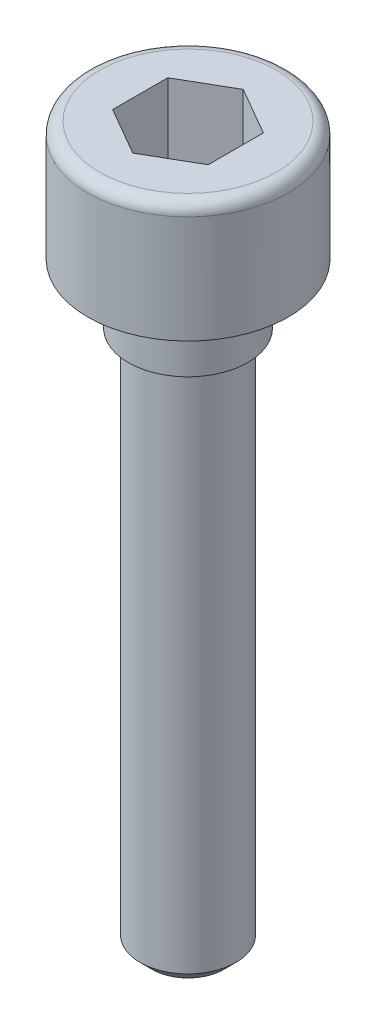
ISO-10303-21;
HEADER;
FILE_DESCRIPTION(('STEP AP214'),'2;1');
FILE_NAME('part.step','',(''),(''),'','','');
FILE_SCHEMA(('AUTOMOTIVE_DESIGN { 1 0 10303 214 1 1 1 1 }'));
ENDSEC;
DATA;
#1=APPLICATION_CONTEXT('core data for automotive mechanical design processes');
#2=APPLICATION_PROTOCOL_DEFINITION('international standard','automotive_design',2000,#1);
#3=PRODUCT_CONTEXT('',#1,'mechanical');
#4=PRODUCT('Part','Part','',(#3));
#5=PRODUCT_RELATED_PRODUCT_CATEGORY('part','',(#4));
#6=PRODUCT_DEFINITION_FORMATION('','',#4);
#7=PRODUCT_DEFINITION_CONTEXT('part definition',#1,'design');
#8=PRODUCT_DEFINITION('design','',#6,#7);
#9=PRODUCT_DEFINITION_SHAPE('','',#8);
#10=(LENGTH_UNIT() NAMED_UNIT(*) SI_UNIT(.MILLI.,.METRE.));
#11=(NAMED_UNIT(*) PLANE_ANGLE_UNIT() SI_UNIT($,.RADIAN.));
#12=(NAMED_UNIT(*) SI_UNIT($,.STERADIAN.) SOLID_ANGLE_UNIT());
#13=UNCERTAINTY_MEASURE_WITH_UNIT(LENGTH_MEASURE(1.E-05),#10,'distance_accuracy_value','');
#14=(GEOMETRIC_REPRESENTATION_CONTEXT(3) GLOBAL_UNCERTAINTY_ASSIGNED_CONTEXT((#13)) GLOBAL_UNIT_ASSIGNED_CONTEXT((#10,
#11,#12)) REPRESENTATION_CONTEXT('',''));
#15=CARTESIAN_POINT('',(0.,0.,0.));
#16=DIRECTION('',(0.,0.,1.));
#17=DIRECTION('',(1.,0.,0.));
#18=AXIS2_PLACEMENT_3D('',#15,#16,#17);
#19=CARTESIAN_POINT('',(0.,0.,0.));
#20=DIRECTION('',(0.,1.,0.));
#21=DIRECTION('',(0.,0.,1.));
#22=AXIS2_PLACEMENT_3D('',#19,#20,#21);
#23=CYLINDRICAL_SURFACE('',#22,2.5);
#24=CARTESIAN_POINT('',(0.,-5.,0.));
#25=DIRECTION('',(0.,1.,0.));
#26=DIRECTION('',(0.,0.,1.));
#27=AXIS2_PLACEMENT_3D('',#24,#25,#26);
#28=CIRCLE('',#27,2.5);
#29=CARTESIAN_POINT('',(0.,-5.,2.5));
#30=VERTEX_POINT('',#29);
#31=EDGE_CURVE('E151',#30,#30,#28,.T.);
#32=ORIENTED_EDGE('',*,*,#31,.F.);
#33=EDGE_LOOP('',(#32));
#34=FACE_BOUND('',#33,.T.);
#35=CARTESIAN_POINT('',(0.,-7.5,0.));
#36=DIRECTION('',(0.,1.,0.));
#37=DIRECTION('',(0.,0.,1.));
#38=AXIS2_PLACEMENT_3D('',#35,#36,#37);
#39=CIRCLE('',#38,2.5);
#40=CARTESIAN_POINT('',(0.,-7.5,2.5));
#41=VERTEX_POINT('',#40);
#42=EDGE_CURVE('E138',#41,#41,#39,.T.);
#43=ORIENTED_EDGE('',*,*,#42,.T.);
#44=EDGE_LOOP('',(#43));
#45=FACE_BOUND('',#44,.T.);
#46=ADVANCED_FACE('F48',(#34,#45),#23,.T.);
#47=CARTESIAN_POINT('',(0.,0.,0.));
#48=DIRECTION('',(0.,-1.,0.));
#49=DIRECTION('',(0.,0.,-1.));
#50=AXIS2_PLACEMENT_3D('',#47,#48,#49);
#51=PLANE('',#50);
#52=CARTESIAN_POINT('',(0.,0.,0.));
#53=DIRECTION('',(0.,-1.,0.));
#54=DIRECTION('',(0.,0.,-1.));
#55=AXIS2_PLACEMENT_3D('',#52,#53,#54);
#56=CIRCLE('',#55,3.7);
#57=CARTESIAN_POINT('',(0.,0.,-3.7));
#58=VERTEX_POINT('',#57);
#59=EDGE_CURVE('E162',#58,#58,#56,.F.);
#60=ORIENTED_EDGE('',*,*,#59,.T.);
#61=EDGE_LOOP('',(#60));
#62=FACE_BOUND('',#61,.T.);
#63=DIRECTION('',(-0.866025403784438,0.,-0.5));
#64=VECTOR('',#63,1.);
#65=CARTESIAN_POINT('',(2.,0.,-1.15470053837925));
#66=LINE('',#65,#64);
#67=CARTESIAN_POINT('',(2.,0.,-1.15470053837925));
#68=VERTEX_POINT('',#67);
#69=CARTESIAN_POINT('',(0.,0.,-2.3094010767585));
#70=VERTEX_POINT('',#69);
#71=EDGE_CURVE('E137',#68,#70,#66,.T.);
#72=ORIENTED_EDGE('',*,*,#71,.F.);
#73=DIRECTION('',(0.,0.,-1.));
#74=VECTOR('',#73,1.);
#75=CARTESIAN_POINT('',(2.,0.,1.15470053837925));
#76=LINE('',#75,#74);
#77=CARTESIAN_POINT('',(2.,0.,1.15470053837925));
#78=VERTEX_POINT('',#77);
#79=EDGE_CURVE('E63',#78,#68,#76,.T.);
#80=ORIENTED_EDGE('',*,*,#79,.F.);
#81=DIRECTION('',(0.866025403784438,0.,-0.5));
#82=VECTOR('',#81,1.);
#83=CARTESIAN_POINT('',(0.,0.,2.3094010767585));
#84=LINE('',#83,#82);
#85=CARTESIAN_POINT('',(0.,0.,2.3094010767585));
#86=VERTEX_POINT('',#85);
#87=EDGE_CURVE('E147',#86,#78,#84,.T.);
#88=ORIENTED_EDGE('',*,*,#87,.F.);
#89=DIRECTION('',(0.866025403784438,0.,0.5));
#90=VECTOR('',#89,1.);
#91=CARTESIAN_POINT('',(-2.,0.,1.15470053837925));
#92=LINE('',#91,#90);
#93=CARTESIAN_POINT('',(-2.,0.,1.15470053837925));
#94=VERTEX_POINT('',#93);
#95=EDGE_CURVE('E145',#94,#86,#92,.T.);
#96=ORIENTED_EDGE('',*,*,#95,.F.);
#97=DIRECTION('',(0.,0.,1.));
#98=VECTOR('',#97,1.);
#99=CARTESIAN_POINT('',(-2.,0.,-1.15470053837925));
#100=LINE('',#99,#98);
#101=CARTESIAN_POINT('',(-2.,0.,-1.15470053837925));
#102=VERTEX_POINT('',#101);
#103=EDGE_CURVE('E111',#102,#94,#100,.T.);
#104=ORIENTED_EDGE('',*,*,#103,.F.);
#105=DIRECTION('',(-0.866025403784439,0.,0.5));
#106=VECTOR('',#105,1.);
#107=CARTESIAN_POINT('',(0.,0.,-2.3094010767585));
#108=LINE('',#107,#106);
#109=EDGE_CURVE('E141',#70,#102,#108,.T.);
#110=ORIENTED_EDGE('',*,*,#109,.F.);
#111=EDGE_LOOP('',(#72,#80,#88,#96,#104,#110));
#112=FACE_BOUND('',#111,.T.);
#113=ADVANCED_FACE('F184',(#62,#112),#51,.F.);
#114=CARTESIAN_POINT('',(0.,0.,0.));
#115=DIRECTION('',(0.,1.,0.));
#116=DIRECTION('',(0.,0.,1.));
#117=AXIS2_PLACEMENT_3D('',#114,#115,#116);
#118=CYLINDRICAL_SURFACE('',#117,4.2);
#119=CARTESIAN_POINT('',(0.,-0.5,0.));
#120=DIRECTION('',(0.,-1.,0.));
#121=DIRECTION('',(0.,0.,-1.));
#122=AXIS2_PLACEMENT_3D('',#119,#120,#121);
#123=CIRCLE('',#122,4.2);
#124=CARTESIAN_POINT('',(0.,-0.5,-4.2));
#125=VERTEX_POINT('',#124);
#126=EDGE_CURVE('E165',#125,#125,#123,.T.);
#127=ORIENTED_EDGE('',*,*,#126,.T.);
#128=EDGE_LOOP('',(#127));
#129=FACE_BOUND('',#128,.T.);
#130=CARTESIAN_POINT('',(0.,-5.,0.));
#131=DIRECTION('',(0.,1.,0.));
#132=DIRECTION('',(0.,0.,1.));
#133=AXIS2_PLACEMENT_3D('',#130,#131,#132);
#134=CIRCLE('',#133,4.2);
#135=CARTESIAN_POINT('',(0.,-5.,4.2));
#136=VERTEX_POINT('',#135);
#137=EDGE_CURVE('E159',#136,#136,#134,.T.);
#138=ORIENTED_EDGE('',*,*,#137,.T.);
#139=EDGE_LOOP('',(#138));
#140=FACE_BOUND('',#139,.T.);
#141=ADVANCED_FACE('F190',(#129,#140),#118,.T.);
#142=CARTESIAN_POINT('',(4.2,-5.,0.));
#143=DIRECTION('',(0.,1.,0.));
#144=DIRECTION('',(0.,0.,1.));
#145=AXIS2_PLACEMENT_3D('',#142,#143,#144);
#146=PLANE('',#145);
#147=ORIENTED_EDGE('',*,*,#137,.F.);
#148=EDGE_LOOP('',(#147));
#149=FACE_BOUND('',#148,.T.);
#150=ORIENTED_EDGE('',*,*,#31,.T.);
#151=EDGE_LOOP('',(#150));
#152=FACE_BOUND('',#151,.T.);
#153=ADVANCED_FACE('F197',(#149,#152),#146,.F.);
#154=CARTESIAN_POINT('',(2.,-3.,1.15470053837925));
#155=DIRECTION('',(1.,0.,0.));
#156=DIRECTION('',(0.,0.,-1.));
#157=AXIS2_PLACEMENT_3D('',#154,#155,#156);
#158=PLANE('',#157);
#159=ORIENTED_EDGE('',*,*,#79,.T.);
#160=DIRECTION('',(0.,1.,0.));
#161=VECTOR('',#160,1.);
#162=CARTESIAN_POINT('',(2.,-3.,-1.15470053837925));
#163=LINE('',#162,#161);
#164=CARTESIAN_POINT('',(2.,-3.,-1.15470053837925));
#165=VERTEX_POINT('',#164);
#166=EDGE_CURVE('E93',#165,#68,#163,.T.);
#167=ORIENTED_EDGE('',*,*,#166,.F.);
#168=DIRECTION('',(0.,0.,-1.));
#169=VECTOR('',#168,1.);
#170=CARTESIAN_POINT('',(2.,-3.,1.15470053837925));
#171=LINE('',#170,#169);
#172=CARTESIAN_POINT('',(2.,-3.,1.15470053837925));
#173=VERTEX_POINT('',#172);
#174=EDGE_CURVE('E149',#173,#165,#171,.T.);
#175=ORIENTED_EDGE('',*,*,#174,.F.);
#176=DIRECTION('',(0.,1.,0.));
#177=VECTOR('',#176,1.);
#178=CARTESIAN_POINT('',(2.,-3.,1.15470053837925));
#179=LINE('',#178,#177);
#180=EDGE_CURVE('E71',#173,#78,#179,.T.);
#181=ORIENTED_EDGE('',*,*,#180,.T.);
#182=EDGE_LOOP('',(#159,#167,#175,#181));
#183=FACE_BOUND('',#182,.T.);
#184=ADVANCED_FACE('F200',(#183),#158,.F.);
#185=CARTESIAN_POINT('',(0.,-3.,2.3094010767585));
#186=DIRECTION('',(0.5,0.,0.866025403784439));
#187=DIRECTION('',(0.866025403784439,0.,-0.5));
#188=AXIS2_PLACEMENT_3D('',#185,#186,#187);
#189=PLANE('',#188);
#190=ORIENTED_EDGE('',*,*,#87,.T.);
#191=ORIENTED_EDGE('',*,*,#180,.F.);
#192=DIRECTION('',(0.866025403784438,0.,-0.5));
#193=VECTOR('',#192,1.);
#194=CARTESIAN_POINT('',(0.,-3.,2.3094010767585));
#195=LINE('',#194,#193);
#196=CARTESIAN_POINT('',(0.,-3.,2.3094010767585));
#197=VERTEX_POINT('',#196);
#198=EDGE_CURVE('E123',#197,#173,#195,.T.);
#199=ORIENTED_EDGE('',*,*,#198,.F.);
#200=DIRECTION('',(0.,1.,0.));
#201=VECTOR('',#200,1.);
#202=CARTESIAN_POINT('',(0.,-3.,2.3094010767585));
#203=LINE('',#202,#201);
#204=EDGE_CURVE('E115',#197,#86,#203,.T.);
#205=ORIENTED_EDGE('',*,*,#204,.T.);
#206=EDGE_LOOP('',(#190,#191,#199,#205));
#207=FACE_BOUND('',#206,.T.);
#208=ADVANCED_FACE('F237',(#207),#189,.F.);
#209=CARTESIAN_POINT('',(-2.,-3.,1.15470053837925));
#210=DIRECTION('',(-0.5,0.,0.866025403784439));
#211=DIRECTION('',(0.866025403784439,0.,0.5));
#212=AXIS2_PLACEMENT_3D('',#209,#210,#211);
#213=PLANE('',#212);
#214=ORIENTED_EDGE('',*,*,#95,.T.);
#215=ORIENTED_EDGE('',*,*,#204,.F.);
#216=DIRECTION('',(0.866025403784438,0.,0.5));
#217=VECTOR('',#216,1.);
#218=CARTESIAN_POINT('',(-2.,-3.,1.15470053837925));
#219=LINE('',#218,#217);
#220=CARTESIAN_POINT('',(-2.,-3.,1.15470053837925));
#221=VERTEX_POINT('',#220);
#222=EDGE_CURVE('E119',#221,#197,#219,.T.);
#223=ORIENTED_EDGE('',*,*,#222,.F.);
#224=DIRECTION('',(0.,1.,0.));
#225=VECTOR('',#224,1.);
#226=CARTESIAN_POINT('',(-2.,-3.,1.15470053837925));
#227=LINE('',#226,#225);
#228=EDGE_CURVE('E104',#221,#94,#227,.T.);
#229=ORIENTED_EDGE('',*,*,#228,.T.);
#230=EDGE_LOOP('',(#214,#215,#223,#229));
#231=FACE_BOUND('',#230,.T.);
#232=ADVANCED_FACE('F120',(#231),#213,.F.);
#233=CARTESIAN_POINT('',(-2.,-3.,-1.15470053837925));
#234=DIRECTION('',(-1.,0.,0.));
#235=DIRECTION('',(0.,0.,1.));
#236=AXIS2_PLACEMENT_3D('',#233,#234,#235);
#237=PLANE('',#236);
#238=ORIENTED_EDGE('',*,*,#103,.T.);
#239=ORIENTED_EDGE('',*,*,#228,.F.);
#240=DIRECTION('',(0.,0.,1.));
#241=VECTOR('',#240,1.);
#242=CARTESIAN_POINT('',(-2.,-3.,-1.15470053837925));
#243=LINE('',#242,#241);
#244=CARTESIAN_POINT('',(-2.,-3.,-1.15470053837925));
#245=VERTEX_POINT('',#244);
#246=EDGE_CURVE('E108',#245,#221,#243,.T.);
#247=ORIENTED_EDGE('',*,*,#246,.F.);
#248=DIRECTION('',(0.,1.,0.));
#249=VECTOR('',#248,1.);
#250=CARTESIAN_POINT('',(-2.,-3.,-1.15470053837925));
#251=LINE('',#250,#249);
#252=EDGE_CURVE('E116',#245,#102,#251,.T.);
#253=ORIENTED_EDGE('',*,*,#252,.T.);
#254=EDGE_LOOP('',(#238,#239,#247,#253));
#255=FACE_BOUND('',#254,.T.);
#256=ADVANCED_FACE('F106',(#255),#237,.F.);
#257=CARTESIAN_POINT('',(0.,-3.,-2.3094010767585));
#258=DIRECTION('',(-0.5,0.,-0.866025403784439));
#259=DIRECTION('',(-0.866025403784439,0.,0.5));
#260=AXIS2_PLACEMENT_3D('',#257,#258,#259);
#261=PLANE('',#260);
#262=ORIENTED_EDGE('',*,*,#109,.T.);
#263=ORIENTED_EDGE('',*,*,#252,.F.);
#264=DIRECTION('',(-0.866025403784439,0.,0.5));
#265=VECTOR('',#264,1.);
#266=CARTESIAN_POINT('',(0.,-3.,-2.3094010767585));
#267=LINE('',#266,#265);
#268=CARTESIAN_POINT('',(0.,-3.,-2.3094010767585));
#269=VERTEX_POINT('',#268);
#270=EDGE_CURVE('E129',#269,#245,#267,.T.);
#271=ORIENTED_EDGE('',*,*,#270,.F.);
#272=DIRECTION('',(0.,1.,0.));
#273=VECTOR('',#272,1.);
#274=CARTESIAN_POINT('',(0.,-3.,-2.3094010767585));
#275=LINE('',#274,#273);
#276=EDGE_CURVE('E154',#269,#70,#275,.T.);
#277=ORIENTED_EDGE('',*,*,#276,.T.);
#278=EDGE_LOOP('',(#262,#263,#271,#277));
#279=FACE_BOUND('',#278,.T.);
#280=ADVANCED_FACE('F244',(#279),#261,.F.);
#281=CARTESIAN_POINT('',(2.,-3.,-1.15470053837925));
#282=DIRECTION('',(0.5,0.,-0.866025403784439));
#283=DIRECTION('',(-0.866025403784439,0.,-0.5));
#284=AXIS2_PLACEMENT_3D('',#281,#282,#283);
#285=PLANE('',#284);
#286=ORIENTED_EDGE('',*,*,#71,.T.);
#287=ORIENTED_EDGE('',*,*,#276,.F.);
#288=DIRECTION('',(-0.866025403784438,0.,-0.5));
#289=VECTOR('',#288,1.);
#290=CARTESIAN_POINT('',(2.,-3.,-1.15470053837925));
#291=LINE('',#290,#289);
#292=EDGE_CURVE('E131',#165,#269,#291,.T.);
#293=ORIENTED_EDGE('',*,*,#292,.F.);
#294=ORIENTED_EDGE('',*,*,#166,.T.);
#295=EDGE_LOOP('',(#286,#287,#293,#294));
#296=FACE_BOUND('',#295,.T.);
#297=ADVANCED_FACE('F212',(#296),#285,.F.);
#298=CARTESIAN_POINT('',(2.,-3.,-1.15470053837925));
#299=DIRECTION('',(0.,1.,0.));
#300=DIRECTION('',(0.,0.,1.));
#301=AXIS2_PLACEMENT_3D('',#298,#299,#300);
#302=PLANE('',#301);
#303=ORIENTED_EDGE('',*,*,#174,.T.);
#304=ORIENTED_EDGE('',*,*,#292,.T.);
#305=ORIENTED_EDGE('',*,*,#270,.T.);
#306=ORIENTED_EDGE('',*,*,#246,.T.);
#307=ORIENTED_EDGE('',*,*,#222,.T.);
#308=ORIENTED_EDGE('',*,*,#198,.T.);
#309=EDGE_LOOP('',(#303,#304,#305,#306,#307,#308));
#310=FACE_BOUND('',#309,.T.);
#311=ADVANCED_FACE('F126',(#310),#302,.T.);
#312=CARTESIAN_POINT('',(0.,-0.5,0.));
#313=DIRECTION('',(0.,-1.,0.));
#314=DIRECTION('',(0.,0.,-1.));
#315=AXIS2_PLACEMENT_3D('',#312,#313,#314);
#316=TOROIDAL_SURFACE('',#315,3.7,0.5);
#317=ORIENTED_EDGE('',*,*,#126,.F.);
#318=EDGE_LOOP('',(#317));
#319=FACE_BOUND('',#318,.T.);
#320=ORIENTED_EDGE('',*,*,#59,.F.);
#321=EDGE_LOOP('',(#320));
#322=FACE_BOUND('',#321,.T.);
#323=ADVANCED_FACE('F204',(#319,#322),#316,.T.);
#324=CARTESIAN_POINT('',(0.,0.,0.));
#325=DIRECTION('',(0.,1.,0.));
#326=DIRECTION('',(0.,0.,1.));
#327=AXIS2_PLACEMENT_3D('',#324,#325,#326);
#328=CYLINDRICAL_SURFACE('',#327,2.);
#329=CARTESIAN_POINT('',(0.,-29.5,0.));
#330=DIRECTION('',(0.,1.,0.));
#331=DIRECTION('',(0.,0.,1.));
#332=AXIS2_PLACEMENT_3D('',#329,#330,#331);
#333=CIRCLE('',#332,2.);
#334=CARTESIAN_POINT('',(0.,-29.5,2.));
#335=VERTEX_POINT('',#334);
#336=EDGE_CURVE('E56',#335,#335,#333,.T.);
#337=ORIENTED_EDGE('',*,*,#336,.T.);
#338=EDGE_LOOP('',(#337));
#339=FACE_BOUND('',#338,.T.);
#340=CARTESIAN_POINT('',(0.,-7.5,0.));
#341=DIRECTION('',(0.,1.,0.));
#342=DIRECTION('',(0.,0.,1.));
#343=AXIS2_PLACEMENT_3D('',#340,#341,#342);
#344=CIRCLE('',#343,2.);
#345=CARTESIAN_POINT('',(0.,-7.5,2.));
#346=VERTEX_POINT('',#345);
#347=EDGE_CURVE('E226',#346,#346,#344,.T.);
#348=ORIENTED_EDGE('',*,*,#347,.F.);
#349=EDGE_LOOP('',(#348));
#350=FACE_BOUND('',#349,.T.);
#351=ADVANCED_FACE('F170',(#339,#350),#328,.T.);
#352=CARTESIAN_POINT('',(2.,-7.5,0.));
#353=DIRECTION('',(0.,-1.,0.));
#354=DIRECTION('',(0.,0.,-1.));
#355=AXIS2_PLACEMENT_3D('',#352,#353,#354);
#356=PLANE('',#355);
#357=ORIENTED_EDGE('',*,*,#347,.T.);
#358=EDGE_LOOP('',(#357));
#359=FACE_BOUND('',#358,.T.);
#360=ORIENTED_EDGE('',*,*,#42,.F.);
#361=EDGE_LOOP('',(#360));
#362=FACE_BOUND('',#361,.T.);
#363=ADVANCED_FACE('F179',(#359,#362),#356,.T.);
#364=CARTESIAN_POINT('',(2.5,-30.,0.));
#365=DIRECTION('',(0.,1.,0.));
#366=DIRECTION('',(0.,0.,1.));
#367=AXIS2_PLACEMENT_3D('',#364,#365,#366);
#368=PLANE('',#367);
#369=CARTESIAN_POINT('',(0.,-30.,0.));
#370=DIRECTION('',(0.,1.,0.));
#371=DIRECTION('',(0.,0.,1.));
#372=AXIS2_PLACEMENT_3D('',#369,#370,#371);
#373=CIRCLE('',#372,1.5);
#374=CARTESIAN_POINT('',(0.,-30.,1.5));
#375=VERTEX_POINT('',#374);
#376=EDGE_CURVE('E13',#375,#375,#373,.F.);
#377=ORIENTED_EDGE('',*,*,#376,.T.);
#378=EDGE_LOOP('',(#377));
#379=FACE_BOUND('',#378,.T.);
#380=ADVANCED_FACE('F174',(#379),#368,.F.);
#381=CARTESIAN_POINT('',(0.,-29.5,0.));
#382=DIRECTION('',(0.,1.,0.));
#383=DIRECTION('',(0.,0.,1.));
#384=AXIS2_PLACEMENT_3D('',#381,#382,#383);
#385=CONICAL_SURFACE('',#384,2.,0.785398163397449);
#386=ORIENTED_EDGE('',*,*,#376,.F.);
#387=EDGE_LOOP('',(#386));
#388=FACE_BOUND('',#387,.T.);
#389=ORIENTED_EDGE('',*,*,#336,.F.);
#390=EDGE_LOOP('',(#389));
#391=FACE_BOUND('',#390,.T.);
#392=ADVANCED_FACE('F50',(#388,#391),#385,.T.);
#393=CLOSED_SHELL('',(#46,#113,#141,#153,#184,#208,#232,#256,#280,#297,#311,#323,#351,#363,#380,#392));
#394=MANIFOLD_SOLID_BREP('B2',#393);
#395=ADVANCED_BREP_SHAPE_REPRESENTATION('',(#18,#394),#14);
#396=SHAPE_DEFINITION_REPRESENTATION(#9,#395);
ENDSEC;
END-ISO-10303-21;
